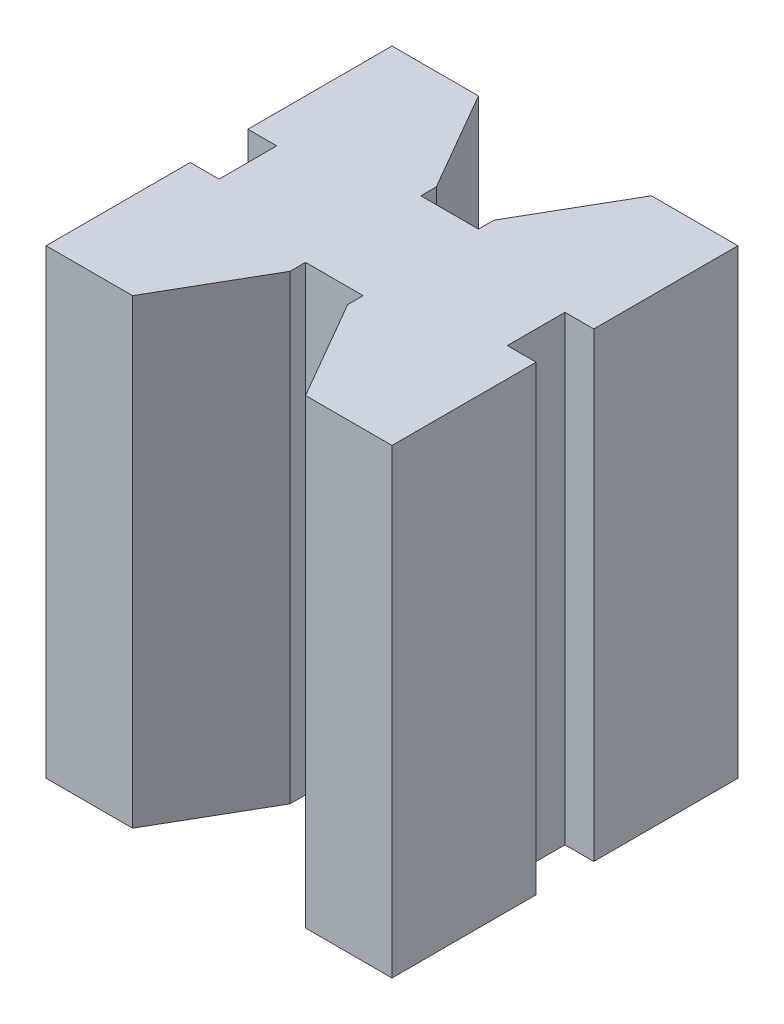
ISO-10303-21;
HEADER;
FILE_DESCRIPTION(('STEP AP214'),'2;1');
FILE_NAME('part.step','',(''),(''),'','','');
FILE_SCHEMA(('AUTOMOTIVE_DESIGN { 1 0 10303 214 1 1 1 1 }'));
ENDSEC;
DATA;
#1=APPLICATION_CONTEXT('core data for automotive mechanical design processes');
#2=APPLICATION_PROTOCOL_DEFINITION('international standard','automotive_design',2000,#1);
#3=PRODUCT_CONTEXT('',#1,'mechanical');
#4=PRODUCT('Part','Part','',(#3));
#5=PRODUCT_RELATED_PRODUCT_CATEGORY('part','',(#4));
#6=PRODUCT_DEFINITION_FORMATION('','',#4);
#7=PRODUCT_DEFINITION_CONTEXT('part definition',#1,'design');
#8=PRODUCT_DEFINITION('design','',#6,#7);
#9=PRODUCT_DEFINITION_SHAPE('','',#8);
#10=(LENGTH_UNIT() NAMED_UNIT(*) SI_UNIT(.MILLI.,.METRE.));
#11=(NAMED_UNIT(*) PLANE_ANGLE_UNIT() SI_UNIT($,.RADIAN.));
#12=(NAMED_UNIT(*) SI_UNIT($,.STERADIAN.) SOLID_ANGLE_UNIT());
#13=UNCERTAINTY_MEASURE_WITH_UNIT(LENGTH_MEASURE(1.E-05),#10,'distance_accuracy_value','');
#14=(GEOMETRIC_REPRESENTATION_CONTEXT(3) GLOBAL_UNCERTAINTY_ASSIGNED_CONTEXT((#13)) GLOBAL_UNIT_ASSIGNED_CONTEXT((#10,
#11,#12)) REPRESENTATION_CONTEXT('',''));
#15=CARTESIAN_POINT('',(0.,0.,0.));
#16=DIRECTION('',(0.,0.,1.));
#17=DIRECTION('',(1.,0.,0.));
#18=AXIS2_PLACEMENT_3D('',#15,#16,#17);
#19=CARTESIAN_POINT('',(0.,40.,12.5));
#20=DIRECTION('',(-1.,0.,0.));
#21=DIRECTION('',(0.,0.,1.));
#22=AXIS2_PLACEMENT_3D('',#19,#20,#21);
#23=PLANE('',#22);
#24=DIRECTION('',(0.,0.,-1.));
#25=VECTOR('',#24,1.);
#26=CARTESIAN_POINT('',(0.,0.,12.5));
#27=LINE('',#26,#25);
#28=CARTESIAN_POINT('',(0.,0.,12.5));
#29=VERTEX_POINT('',#28);
#30=CARTESIAN_POINT('',(0.,0.,0.));
#31=VERTEX_POINT('',#30);
#32=EDGE_CURVE('E230',#29,#31,#27,.T.);
#33=ORIENTED_EDGE('',*,*,#32,.T.);
#34=DIRECTION('',(0.,-1.,0.));
#35=VECTOR('',#34,1.);
#36=CARTESIAN_POINT('',(0.,40.,0.));
#37=LINE('',#36,#35);
#38=CARTESIAN_POINT('',(0.,40.,0.));
#39=VERTEX_POINT('',#38);
#40=EDGE_CURVE('E11',#39,#31,#37,.T.);
#41=ORIENTED_EDGE('',*,*,#40,.F.);
#42=DIRECTION('',(0.,0.,-1.));
#43=VECTOR('',#42,1.);
#44=CARTESIAN_POINT('',(0.,40.,12.5));
#45=LINE('',#44,#43);
#46=CARTESIAN_POINT('',(0.,40.,12.5));
#47=VERTEX_POINT('',#46);
#48=EDGE_CURVE('E276',#47,#39,#45,.T.);
#49=ORIENTED_EDGE('',*,*,#48,.F.);
#50=DIRECTION('',(0.,-1.,0.));
#51=VECTOR('',#50,1.);
#52=CARTESIAN_POINT('',(0.,40.,12.5));
#53=LINE('',#52,#51);
#54=EDGE_CURVE('E226',#47,#29,#53,.T.);
#55=ORIENTED_EDGE('',*,*,#54,.T.);
#56=EDGE_LOOP('',(#33,#41,#49,#55));
#57=FACE_BOUND('',#56,.T.);
#58=ADVANCED_FACE('F38',(#57),#23,.F.);
#59=CARTESIAN_POINT('',(-7.5,40.,0.));
#60=DIRECTION('',(0.,0.,1.));
#61=DIRECTION('',(1.,0.,0.));
#62=AXIS2_PLACEMENT_3D('',#59,#60,#61);
#63=PLANE('',#62);
#64=DIRECTION('',(-1.,0.,0.));
#65=VECTOR('',#64,1.);
#66=CARTESIAN_POINT('',(-7.5,0.,0.));
#67=LINE('',#66,#65);
#68=CARTESIAN_POINT('',(-7.5,0.,0.));
#69=VERTEX_POINT('',#68);
#70=EDGE_CURVE('E233',#31,#69,#67,.T.);
#71=ORIENTED_EDGE('',*,*,#70,.T.);
#72=DIRECTION('',(0.,-1.,0.));
#73=VECTOR('',#72,1.);
#74=CARTESIAN_POINT('',(-7.5,40.,0.));
#75=LINE('',#74,#73);
#76=CARTESIAN_POINT('',(-7.5,40.,0.));
#77=VERTEX_POINT('',#76);
#78=EDGE_CURVE('E46',#77,#69,#75,.T.);
#79=ORIENTED_EDGE('',*,*,#78,.F.);
#80=DIRECTION('',(-1.,0.,0.));
#81=VECTOR('',#80,1.);
#82=CARTESIAN_POINT('',(-7.5,40.,0.));
#83=LINE('',#82,#81);
#84=EDGE_CURVE('E145',#39,#77,#83,.T.);
#85=ORIENTED_EDGE('',*,*,#84,.F.);
#86=ORIENTED_EDGE('',*,*,#40,.T.);
#87=EDGE_LOOP('',(#71,#79,#85,#86));
#88=FACE_BOUND('',#87,.T.);
#89=ADVANCED_FACE('F414',(#88),#63,.F.);
#90=CARTESIAN_POINT('',(-12.5,40.,8.6602540378444));
#91=DIRECTION('',(0.866025403784439,0.,0.5));
#92=DIRECTION('',(0.5,0.,-0.866025403784439));
#93=AXIS2_PLACEMENT_3D('',#90,#91,#92);
#94=PLANE('',#93);
#95=DIRECTION('',(-0.5,0.,0.866025403784439));
#96=VECTOR('',#95,1.);
#97=CARTESIAN_POINT('',(-12.5,0.,8.6602540378444));
#98=LINE('',#97,#96);
#99=CARTESIAN_POINT('',(-12.5,0.,8.6602540378444));
#100=VERTEX_POINT('',#99);
#101=EDGE_CURVE('E235',#69,#100,#98,.T.);
#102=ORIENTED_EDGE('',*,*,#101,.T.);
#103=DIRECTION('',(0.,-1.,0.));
#104=VECTOR('',#103,1.);
#105=CARTESIAN_POINT('',(-12.5,40.,8.6602540378444));
#106=LINE('',#105,#104);
#107=CARTESIAN_POINT('',(-12.5,40.,8.6602540378444));
#108=VERTEX_POINT('',#107);
#109=EDGE_CURVE('E331',#108,#100,#106,.T.);
#110=ORIENTED_EDGE('',*,*,#109,.F.);
#111=DIRECTION('',(-0.5,0.,0.866025403784439));
#112=VECTOR('',#111,1.);
#113=CARTESIAN_POINT('',(-12.5,40.,8.6602540378444));
#114=LINE('',#113,#112);
#115=EDGE_CURVE('E339',#77,#108,#114,.T.);
#116=ORIENTED_EDGE('',*,*,#115,.F.);
#117=ORIENTED_EDGE('',*,*,#78,.T.);
#118=EDGE_LOOP('',(#102,#110,#116,#117));
#119=FACE_BOUND('',#118,.T.);
#120=ADVANCED_FACE('F337',(#119),#94,.F.);
#121=CARTESIAN_POINT('',(-12.5,40.,10.));
#122=DIRECTION('',(1.,0.,0.));
#123=DIRECTION('',(0.,0.,-1.));
#124=AXIS2_PLACEMENT_3D('',#121,#122,#123);
#125=PLANE('',#124);
#126=DIRECTION('',(0.,0.,1.));
#127=VECTOR('',#126,1.);
#128=CARTESIAN_POINT('',(-12.5,0.,10.));
#129=LINE('',#128,#127);
#130=CARTESIAN_POINT('',(-12.5,0.,10.));
#131=VERTEX_POINT('',#130);
#132=EDGE_CURVE('E237',#100,#131,#129,.T.);
#133=ORIENTED_EDGE('',*,*,#132,.T.);
#134=DIRECTION('',(0.,-1.,0.));
#135=VECTOR('',#134,1.);
#136=CARTESIAN_POINT('',(-12.5,40.,10.));
#137=LINE('',#136,#135);
#138=CARTESIAN_POINT('',(-12.5,40.,10.));
#139=VERTEX_POINT('',#138);
#140=EDGE_CURVE('E328',#139,#131,#137,.T.);
#141=ORIENTED_EDGE('',*,*,#140,.F.);
#142=DIRECTION('',(0.,0.,1.));
#143=VECTOR('',#142,1.);
#144=CARTESIAN_POINT('',(-12.5,40.,10.));
#145=LINE('',#144,#143);
#146=EDGE_CURVE('E357',#108,#139,#145,.T.);
#147=ORIENTED_EDGE('',*,*,#146,.F.);
#148=ORIENTED_EDGE('',*,*,#109,.T.);
#149=EDGE_LOOP('',(#133,#141,#147,#148));
#150=FACE_BOUND('',#149,.T.);
#151=ADVANCED_FACE('F348',(#150),#125,.F.);
#152=CARTESIAN_POINT('',(-17.5,40.,10.));
#153=DIRECTION('',(0.,0.,1.));
#154=DIRECTION('',(1.,0.,0.));
#155=AXIS2_PLACEMENT_3D('',#152,#153,#154);
#156=PLANE('',#155);
#157=DIRECTION('',(-1.,0.,0.));
#158=VECTOR('',#157,1.);
#159=CARTESIAN_POINT('',(-17.5,0.,10.));
#160=LINE('',#159,#158);
#161=CARTESIAN_POINT('',(-17.5,0.,10.));
#162=VERTEX_POINT('',#161);
#163=EDGE_CURVE('E239',#131,#162,#160,.T.);
#164=ORIENTED_EDGE('',*,*,#163,.T.);
#165=DIRECTION('',(0.,-1.,0.));
#166=VECTOR('',#165,1.);
#167=CARTESIAN_POINT('',(-17.5,40.,10.));
#168=LINE('',#167,#166);
#169=CARTESIAN_POINT('',(-17.5,40.,10.));
#170=VERTEX_POINT('',#169);
#171=EDGE_CURVE('E325',#170,#162,#168,.T.);
#172=ORIENTED_EDGE('',*,*,#171,.F.);
#173=DIRECTION('',(-1.,0.,0.));
#174=VECTOR('',#173,1.);
#175=CARTESIAN_POINT('',(-17.5,40.,10.));
#176=LINE('',#175,#174);
#177=EDGE_CURVE('E354',#139,#170,#176,.T.);
#178=ORIENTED_EDGE('',*,*,#177,.F.);
#179=ORIENTED_EDGE('',*,*,#140,.T.);
#180=EDGE_LOOP('',(#164,#172,#178,#179));
#181=FACE_BOUND('',#180,.T.);
#182=ADVANCED_FACE('F352',(#181),#156,.F.);
#183=CARTESIAN_POINT('',(-17.5,40.,10.));
#184=DIRECTION('',(-1.,0.,0.));
#185=DIRECTION('',(0.,0.,1.));
#186=AXIS2_PLACEMENT_3D('',#183,#184,#185);
#187=PLANE('',#186);
#188=DIRECTION('',(0.,0.,-1.));
#189=VECTOR('',#188,1.);
#190=CARTESIAN_POINT('',(-17.5,0.,10.));
#191=LINE('',#190,#189);
#192=CARTESIAN_POINT('',(-17.5,0.,8.66025403784438));
#193=VERTEX_POINT('',#192);
#194=EDGE_CURVE('E241',#162,#193,#191,.T.);
#195=ORIENTED_EDGE('',*,*,#194,.T.);
#196=DIRECTION('',(0.,-1.,0.));
#197=VECTOR('',#196,1.);
#198=CARTESIAN_POINT('',(-17.5,40.,8.66025403784438));
#199=LINE('',#198,#197);
#200=CARTESIAN_POINT('',(-17.5,40.,8.66025403784438));
#201=VERTEX_POINT('',#200);
#202=EDGE_CURVE('E322',#201,#193,#199,.T.);
#203=ORIENTED_EDGE('',*,*,#202,.F.);
#204=DIRECTION('',(0.,0.,-1.));
#205=VECTOR('',#204,1.);
#206=CARTESIAN_POINT('',(-17.5,40.,10.));
#207=LINE('',#206,#205);
#208=EDGE_CURVE('E356',#170,#201,#207,.T.);
#209=ORIENTED_EDGE('',*,*,#208,.F.);
#210=ORIENTED_EDGE('',*,*,#171,.T.);
#211=EDGE_LOOP('',(#195,#203,#209,#210));
#212=FACE_BOUND('',#211,.T.);
#213=ADVANCED_FACE('F427',(#212),#187,.F.);
#214=CARTESIAN_POINT('',(-22.5,40.,0.));
#215=DIRECTION('',(-0.866025403784438,0.,0.5));
#216=DIRECTION('',(0.5,0.,0.866025403784439));
#217=AXIS2_PLACEMENT_3D('',#214,#215,#216);
#218=PLANE('',#217);
#219=DIRECTION('',(-0.5,0.,-0.866025403784438));
#220=VECTOR('',#219,1.);
#221=CARTESIAN_POINT('',(-22.5,0.,0.));
#222=LINE('',#221,#220);
#223=CARTESIAN_POINT('',(-22.5,0.,0.));
#224=VERTEX_POINT('',#223);
#225=EDGE_CURVE('E243',#193,#224,#222,.T.);
#226=ORIENTED_EDGE('',*,*,#225,.T.);
#227=DIRECTION('',(0.,-1.,0.));
#228=VECTOR('',#227,1.);
#229=CARTESIAN_POINT('',(-22.5,40.,0.));
#230=LINE('',#229,#228);
#231=CARTESIAN_POINT('',(-22.5,40.,0.));
#232=VERTEX_POINT('',#231);
#233=EDGE_CURVE('E319',#232,#224,#230,.T.);
#234=ORIENTED_EDGE('',*,*,#233,.F.);
#235=DIRECTION('',(-0.5,0.,-0.866025403784438));
#236=VECTOR('',#235,1.);
#237=CARTESIAN_POINT('',(-22.5,40.,0.));
#238=LINE('',#237,#236);
#239=EDGE_CURVE('E359',#201,#232,#238,.T.);
#240=ORIENTED_EDGE('',*,*,#239,.F.);
#241=ORIENTED_EDGE('',*,*,#202,.T.);
#242=EDGE_LOOP('',(#226,#234,#240,#241));
#243=FACE_BOUND('',#242,.T.);
#244=ADVANCED_FACE('F430',(#243),#218,.F.);
#245=CARTESIAN_POINT('',(-30.,40.,0.));
#246=DIRECTION('',(0.,0.,1.));
#247=DIRECTION('',(1.,0.,0.));
#248=AXIS2_PLACEMENT_3D('',#245,#246,#247);
#249=PLANE('',#248);
#250=DIRECTION('',(-1.,0.,0.));
#251=VECTOR('',#250,1.);
#252=CARTESIAN_POINT('',(-30.,0.,0.));
#253=LINE('',#252,#251);
#254=CARTESIAN_POINT('',(-30.,0.,0.));
#255=VERTEX_POINT('',#254);
#256=EDGE_CURVE('E245',#224,#255,#253,.T.);
#257=ORIENTED_EDGE('',*,*,#256,.T.);
#258=DIRECTION('',(0.,-1.,0.));
#259=VECTOR('',#258,1.);
#260=CARTESIAN_POINT('',(-30.,40.,0.));
#261=LINE('',#260,#259);
#262=CARTESIAN_POINT('',(-30.,40.,0.));
#263=VERTEX_POINT('',#262);
#264=EDGE_CURVE('E316',#263,#255,#261,.T.);
#265=ORIENTED_EDGE('',*,*,#264,.F.);
#266=DIRECTION('',(-1.,0.,0.));
#267=VECTOR('',#266,1.);
#268=CARTESIAN_POINT('',(-30.,40.,0.));
#269=LINE('',#268,#267);
#270=EDGE_CURVE('E365',#232,#263,#269,.T.);
#271=ORIENTED_EDGE('',*,*,#270,.F.);
#272=ORIENTED_EDGE('',*,*,#233,.T.);
#273=EDGE_LOOP('',(#257,#265,#271,#272));
#274=FACE_BOUND('',#273,.T.);
#275=ADVANCED_FACE('F434',(#274),#249,.F.);
#276=CARTESIAN_POINT('',(-30.,40.,0.));
#277=DIRECTION('',(1.,0.,0.));
#278=DIRECTION('',(0.,0.,-1.));
#279=AXIS2_PLACEMENT_3D('',#276,#277,#278);
#280=PLANE('',#279);
#281=DIRECTION('',(0.,0.,1.));
#282=VECTOR('',#281,1.);
#283=CARTESIAN_POINT('',(-30.,0.,0.));
#284=LINE('',#283,#282);
#285=CARTESIAN_POINT('',(-30.,0.,12.5));
#286=VERTEX_POINT('',#285);
#287=EDGE_CURVE('E247',#255,#286,#284,.T.);
#288=ORIENTED_EDGE('',*,*,#287,.T.);
#289=DIRECTION('',(0.,-1.,0.));
#290=VECTOR('',#289,1.);
#291=CARTESIAN_POINT('',(-30.,40.,12.5));
#292=LINE('',#291,#290);
#293=CARTESIAN_POINT('',(-30.,40.,12.5));
#294=VERTEX_POINT('',#293);
#295=EDGE_CURVE('E313',#294,#286,#292,.T.);
#296=ORIENTED_EDGE('',*,*,#295,.F.);
#297=DIRECTION('',(0.,0.,1.));
#298=VECTOR('',#297,1.);
#299=CARTESIAN_POINT('',(-30.,40.,0.));
#300=LINE('',#299,#298);
#301=EDGE_CURVE('E367',#263,#294,#300,.T.);
#302=ORIENTED_EDGE('',*,*,#301,.F.);
#303=ORIENTED_EDGE('',*,*,#264,.T.);
#304=EDGE_LOOP('',(#288,#296,#302,#303));
#305=FACE_BOUND('',#304,.T.);
#306=ADVANCED_FACE('F438',(#305),#280,.F.);
#307=CARTESIAN_POINT('',(-30.,40.,12.5));
#308=DIRECTION('',(0.,0.,-1.));
#309=DIRECTION('',(-1.,0.,0.));
#310=AXIS2_PLACEMENT_3D('',#307,#308,#309);
#311=PLANE('',#310);
#312=DIRECTION('',(1.,0.,0.));
#313=VECTOR('',#312,1.);
#314=CARTESIAN_POINT('',(-30.,0.,12.5));
#315=LINE('',#314,#313);
#316=CARTESIAN_POINT('',(-27.5,0.,12.5));
#317=VERTEX_POINT('',#316);
#318=EDGE_CURVE('E249',#286,#317,#315,.T.);
#319=ORIENTED_EDGE('',*,*,#318,.T.);
#320=DIRECTION('',(0.,-1.,0.));
#321=VECTOR('',#320,1.);
#322=CARTESIAN_POINT('',(-27.5,40.,12.5));
#323=LINE('',#322,#321);
#324=CARTESIAN_POINT('',(-27.5,40.,12.5));
#325=VERTEX_POINT('',#324);
#326=EDGE_CURVE('E310',#325,#317,#323,.T.);
#327=ORIENTED_EDGE('',*,*,#326,.F.);
#328=DIRECTION('',(1.,0.,0.));
#329=VECTOR('',#328,1.);
#330=CARTESIAN_POINT('',(-30.,40.,12.5));
#331=LINE('',#330,#329);
#332=EDGE_CURVE('E369',#294,#325,#331,.T.);
#333=ORIENTED_EDGE('',*,*,#332,.F.);
#334=ORIENTED_EDGE('',*,*,#295,.T.);
#335=EDGE_LOOP('',(#319,#327,#333,#334));
#336=FACE_BOUND('',#335,.T.);
#337=ADVANCED_FACE('F442',(#336),#311,.F.);
#338=CARTESIAN_POINT('',(-27.5,40.,12.5));
#339=DIRECTION('',(1.,0.,0.));
#340=DIRECTION('',(0.,0.,-1.));
#341=AXIS2_PLACEMENT_3D('',#338,#339,#340);
#342=PLANE('',#341);
#343=DIRECTION('',(0.,0.,1.));
#344=VECTOR('',#343,1.);
#345=CARTESIAN_POINT('',(-27.5,0.,12.5));
#346=LINE('',#345,#344);
#347=CARTESIAN_POINT('',(-27.5,0.,17.5));
#348=VERTEX_POINT('',#347);
#349=EDGE_CURVE('E251',#317,#348,#346,.T.);
#350=ORIENTED_EDGE('',*,*,#349,.T.);
#351=DIRECTION('',(0.,-1.,0.));
#352=VECTOR('',#351,1.);
#353=CARTESIAN_POINT('',(-27.5,40.,17.5));
#354=LINE('',#353,#352);
#355=CARTESIAN_POINT('',(-27.5,40.,17.5));
#356=VERTEX_POINT('',#355);
#357=EDGE_CURVE('E307',#356,#348,#354,.T.);
#358=ORIENTED_EDGE('',*,*,#357,.F.);
#359=DIRECTION('',(0.,0.,1.));
#360=VECTOR('',#359,1.);
#361=CARTESIAN_POINT('',(-27.5,40.,12.5));
#362=LINE('',#361,#360);
#363=EDGE_CURVE('E371',#325,#356,#362,.T.);
#364=ORIENTED_EDGE('',*,*,#363,.F.);
#365=ORIENTED_EDGE('',*,*,#326,.T.);
#366=EDGE_LOOP('',(#350,#358,#364,#365));
#367=FACE_BOUND('',#366,.T.);
#368=ADVANCED_FACE('F446',(#367),#342,.F.);
#369=CARTESIAN_POINT('',(-27.5,40.,17.5));
#370=DIRECTION('',(0.,0.,1.));
#371=DIRECTION('',(1.,0.,0.));
#372=AXIS2_PLACEMENT_3D('',#369,#370,#371);
#373=PLANE('',#372);
#374=DIRECTION('',(-1.,0.,0.));
#375=VECTOR('',#374,1.);
#376=CARTESIAN_POINT('',(-27.5,0.,17.5));
#377=LINE('',#376,#375);
#378=CARTESIAN_POINT('',(-30.,0.,17.5));
#379=VERTEX_POINT('',#378);
#380=EDGE_CURVE('E253',#348,#379,#377,.T.);
#381=ORIENTED_EDGE('',*,*,#380,.T.);
#382=DIRECTION('',(0.,-1.,0.));
#383=VECTOR('',#382,1.);
#384=CARTESIAN_POINT('',(-30.,40.,17.5));
#385=LINE('',#384,#383);
#386=CARTESIAN_POINT('',(-30.,40.,17.5));
#387=VERTEX_POINT('',#386);
#388=EDGE_CURVE('E304',#387,#379,#385,.T.);
#389=ORIENTED_EDGE('',*,*,#388,.F.);
#390=DIRECTION('',(-1.,0.,0.));
#391=VECTOR('',#390,1.);
#392=CARTESIAN_POINT('',(-27.5,40.,17.5));
#393=LINE('',#392,#391);
#394=EDGE_CURVE('E373',#356,#387,#393,.T.);
#395=ORIENTED_EDGE('',*,*,#394,.F.);
#396=ORIENTED_EDGE('',*,*,#357,.T.);
#397=EDGE_LOOP('',(#381,#389,#395,#396));
#398=FACE_BOUND('',#397,.T.);
#399=ADVANCED_FACE('F450',(#398),#373,.F.);
#400=CARTESIAN_POINT('',(-30.,40.,17.5));
#401=DIRECTION('',(1.,0.,0.));
#402=DIRECTION('',(0.,0.,-1.));
#403=AXIS2_PLACEMENT_3D('',#400,#401,#402);
#404=PLANE('',#403);
#405=DIRECTION('',(0.,0.,1.));
#406=VECTOR('',#405,1.);
#407=CARTESIAN_POINT('',(-30.,0.,17.5));
#408=LINE('',#407,#406);
#409=CARTESIAN_POINT('',(-30.,0.,30.));
#410=VERTEX_POINT('',#409);
#411=EDGE_CURVE('E255',#379,#410,#408,.T.);
#412=ORIENTED_EDGE('',*,*,#411,.T.);
#413=DIRECTION('',(0.,-1.,0.));
#414=VECTOR('',#413,1.);
#415=CARTESIAN_POINT('',(-30.,40.,30.));
#416=LINE('',#415,#414);
#417=CARTESIAN_POINT('',(-30.,40.,30.));
#418=VERTEX_POINT('',#417);
#419=EDGE_CURVE('E301',#418,#410,#416,.T.);
#420=ORIENTED_EDGE('',*,*,#419,.F.);
#421=DIRECTION('',(0.,0.,1.));
#422=VECTOR('',#421,1.);
#423=CARTESIAN_POINT('',(-30.,40.,17.5));
#424=LINE('',#423,#422);
#425=EDGE_CURVE('E375',#387,#418,#424,.T.);
#426=ORIENTED_EDGE('',*,*,#425,.F.);
#427=ORIENTED_EDGE('',*,*,#388,.T.);
#428=EDGE_LOOP('',(#412,#420,#426,#427));
#429=FACE_BOUND('',#428,.T.);
#430=ADVANCED_FACE('F454',(#429),#404,.F.);
#431=CARTESIAN_POINT('',(-30.,40.,30.));
#432=DIRECTION('',(0.,0.,-1.));
#433=DIRECTION('',(-1.,0.,0.));
#434=AXIS2_PLACEMENT_3D('',#431,#432,#433);
#435=PLANE('',#434);
#436=DIRECTION('',(1.,0.,0.));
#437=VECTOR('',#436,1.);
#438=CARTESIAN_POINT('',(-30.,0.,30.));
#439=LINE('',#438,#437);
#440=CARTESIAN_POINT('',(-22.5,0.,30.));
#441=VERTEX_POINT('',#440);
#442=EDGE_CURVE('E257',#410,#441,#439,.T.);
#443=ORIENTED_EDGE('',*,*,#442,.T.);
#444=DIRECTION('',(0.,-1.,0.));
#445=VECTOR('',#444,1.);
#446=CARTESIAN_POINT('',(-22.5,40.,30.));
#447=LINE('',#446,#445);
#448=CARTESIAN_POINT('',(-22.5,40.,30.));
#449=VERTEX_POINT('',#448);
#450=EDGE_CURVE('E298',#449,#441,#447,.T.);
#451=ORIENTED_EDGE('',*,*,#450,.F.);
#452=DIRECTION('',(1.,0.,0.));
#453=VECTOR('',#452,1.);
#454=CARTESIAN_POINT('',(-30.,40.,30.));
#455=LINE('',#454,#453);
#456=EDGE_CURVE('E377',#418,#449,#455,.T.);
#457=ORIENTED_EDGE('',*,*,#456,.F.);
#458=ORIENTED_EDGE('',*,*,#419,.T.);
#459=EDGE_LOOP('',(#443,#451,#457,#458));
#460=FACE_BOUND('',#459,.T.);
#461=ADVANCED_FACE('F458',(#460),#435,.F.);
#462=CARTESIAN_POINT('',(-17.5,40.,21.3397459621556));
#463=DIRECTION('',(-0.866025403784439,0.,-0.5));
#464=DIRECTION('',(-0.5,0.,0.866025403784439));
#465=AXIS2_PLACEMENT_3D('',#462,#463,#464);
#466=PLANE('',#465);
#467=DIRECTION('',(0.5,0.,-0.866025403784438));
#468=VECTOR('',#467,1.);
#469=CARTESIAN_POINT('',(-17.5,0.,21.3397459621556));
#470=LINE('',#469,#468);
#471=CARTESIAN_POINT('',(-17.5,0.,21.3397459621556));
#472=VERTEX_POINT('',#471);
#473=EDGE_CURVE('E259',#441,#472,#470,.T.);
#474=ORIENTED_EDGE('',*,*,#473,.T.);
#475=DIRECTION('',(0.,-1.,0.));
#476=VECTOR('',#475,1.);
#477=CARTESIAN_POINT('',(-17.5,40.,21.3397459621556));
#478=LINE('',#477,#476);
#479=CARTESIAN_POINT('',(-17.5,40.,21.3397459621556));
#480=VERTEX_POINT('',#479);
#481=EDGE_CURVE('E295',#480,#472,#478,.T.);
#482=ORIENTED_EDGE('',*,*,#481,.F.);
#483=DIRECTION('',(0.5,0.,-0.866025403784438));
#484=VECTOR('',#483,1.);
#485=CARTESIAN_POINT('',(-17.5,40.,21.3397459621556));
#486=LINE('',#485,#484);
#487=EDGE_CURVE('E379',#449,#480,#486,.T.);
#488=ORIENTED_EDGE('',*,*,#487,.F.);
#489=ORIENTED_EDGE('',*,*,#450,.T.);
#490=EDGE_LOOP('',(#474,#482,#488,#489));
#491=FACE_BOUND('',#490,.T.);
#492=ADVANCED_FACE('F462',(#491),#466,.F.);
#493=CARTESIAN_POINT('',(-17.5,40.,20.));
#494=DIRECTION('',(-1.,0.,0.));
#495=DIRECTION('',(0.,0.,1.));
#496=AXIS2_PLACEMENT_3D('',#493,#494,#495);
#497=PLANE('',#496);
#498=DIRECTION('',(0.,0.,-1.));
#499=VECTOR('',#498,1.);
#500=CARTESIAN_POINT('',(-17.5,0.,20.));
#501=LINE('',#500,#499);
#502=CARTESIAN_POINT('',(-17.5,0.,20.));
#503=VERTEX_POINT('',#502);
#504=EDGE_CURVE('E261',#472,#503,#501,.T.);
#505=ORIENTED_EDGE('',*,*,#504,.T.);
#506=DIRECTION('',(0.,-1.,0.));
#507=VECTOR('',#506,1.);
#508=CARTESIAN_POINT('',(-17.5,40.,20.));
#509=LINE('',#508,#507);
#510=CARTESIAN_POINT('',(-17.5,40.,20.));
#511=VERTEX_POINT('',#510);
#512=EDGE_CURVE('E292',#511,#503,#509,.T.);
#513=ORIENTED_EDGE('',*,*,#512,.F.);
#514=DIRECTION('',(0.,0.,-1.));
#515=VECTOR('',#514,1.);
#516=CARTESIAN_POINT('',(-17.5,40.,20.));
#517=LINE('',#516,#515);
#518=EDGE_CURVE('E381',#480,#511,#517,.T.);
#519=ORIENTED_EDGE('',*,*,#518,.F.);
#520=ORIENTED_EDGE('',*,*,#481,.T.);
#521=EDGE_LOOP('',(#505,#513,#519,#520));
#522=FACE_BOUND('',#521,.T.);
#523=ADVANCED_FACE('F466',(#522),#497,.F.);
#524=CARTESIAN_POINT('',(-17.5,40.,20.));
#525=DIRECTION('',(0.,0.,-1.));
#526=DIRECTION('',(-1.,0.,0.));
#527=AXIS2_PLACEMENT_3D('',#524,#525,#526);
#528=PLANE('',#527);
#529=DIRECTION('',(1.,0.,0.));
#530=VECTOR('',#529,1.);
#531=CARTESIAN_POINT('',(-17.5,0.,20.));
#532=LINE('',#531,#530);
#533=CARTESIAN_POINT('',(-12.5,0.,20.));
#534=VERTEX_POINT('',#533);
#535=EDGE_CURVE('E263',#503,#534,#532,.T.);
#536=ORIENTED_EDGE('',*,*,#535,.T.);
#537=DIRECTION('',(0.,-1.,0.));
#538=VECTOR('',#537,1.);
#539=CARTESIAN_POINT('',(-12.5,40.,20.));
#540=LINE('',#539,#538);
#541=CARTESIAN_POINT('',(-12.5,40.,20.));
#542=VERTEX_POINT('',#541);
#543=EDGE_CURVE('E289',#542,#534,#540,.T.);
#544=ORIENTED_EDGE('',*,*,#543,.F.);
#545=DIRECTION('',(1.,0.,0.));
#546=VECTOR('',#545,1.);
#547=CARTESIAN_POINT('',(-17.5,40.,20.));
#548=LINE('',#547,#546);
#549=EDGE_CURVE('E383',#511,#542,#548,.T.);
#550=ORIENTED_EDGE('',*,*,#549,.F.);
#551=ORIENTED_EDGE('',*,*,#512,.T.);
#552=EDGE_LOOP('',(#536,#544,#550,#551));
#553=FACE_BOUND('',#552,.T.);
#554=ADVANCED_FACE('F470',(#553),#528,.F.);
#555=CARTESIAN_POINT('',(-12.5,40.,20.));
#556=DIRECTION('',(1.,0.,0.));
#557=DIRECTION('',(0.,0.,-1.));
#558=AXIS2_PLACEMENT_3D('',#555,#556,#557);
#559=PLANE('',#558);
#560=DIRECTION('',(0.,0.,1.));
#561=VECTOR('',#560,1.);
#562=CARTESIAN_POINT('',(-12.5,0.,20.));
#563=LINE('',#562,#561);
#564=CARTESIAN_POINT('',(-12.5,0.,21.3397459621556));
#565=VERTEX_POINT('',#564);
#566=EDGE_CURVE('E265',#534,#565,#563,.T.);
#567=ORIENTED_EDGE('',*,*,#566,.T.);
#568=DIRECTION('',(0.,-1.,0.));
#569=VECTOR('',#568,1.);
#570=CARTESIAN_POINT('',(-12.5,40.,21.3397459621556));
#571=LINE('',#570,#569);
#572=CARTESIAN_POINT('',(-12.5,40.,21.3397459621556));
#573=VERTEX_POINT('',#572);
#574=EDGE_CURVE('E286',#573,#565,#571,.T.);
#575=ORIENTED_EDGE('',*,*,#574,.F.);
#576=DIRECTION('',(0.,0.,1.));
#577=VECTOR('',#576,1.);
#578=CARTESIAN_POINT('',(-12.5,40.,20.));
#579=LINE('',#578,#577);
#580=EDGE_CURVE('E385',#542,#573,#579,.T.);
#581=ORIENTED_EDGE('',*,*,#580,.F.);
#582=ORIENTED_EDGE('',*,*,#543,.T.);
#583=EDGE_LOOP('',(#567,#575,#581,#582));
#584=FACE_BOUND('',#583,.T.);
#585=ADVANCED_FACE('F474',(#584),#559,.F.);
#586=CARTESIAN_POINT('',(-7.5,40.,30.));
#587=DIRECTION('',(0.866025403784438,0.,-0.5));
#588=DIRECTION('',(-0.5,0.,-0.866025403784439));
#589=AXIS2_PLACEMENT_3D('',#586,#587,#588);
#590=PLANE('',#589);
#591=DIRECTION('',(0.5,0.,0.866025403784438));
#592=VECTOR('',#591,1.);
#593=CARTESIAN_POINT('',(-7.5,0.,30.));
#594=LINE('',#593,#592);
#595=CARTESIAN_POINT('',(-7.5,0.,30.));
#596=VERTEX_POINT('',#595);
#597=EDGE_CURVE('E267',#565,#596,#594,.T.);
#598=ORIENTED_EDGE('',*,*,#597,.T.);
#599=DIRECTION('',(0.,-1.,0.));
#600=VECTOR('',#599,1.);
#601=CARTESIAN_POINT('',(-7.5,40.,30.));
#602=LINE('',#601,#600);
#603=CARTESIAN_POINT('',(-7.5,40.,30.));
#604=VERTEX_POINT('',#603);
#605=EDGE_CURVE('E283',#604,#596,#602,.T.);
#606=ORIENTED_EDGE('',*,*,#605,.F.);
#607=DIRECTION('',(0.5,0.,0.866025403784438));
#608=VECTOR('',#607,1.);
#609=CARTESIAN_POINT('',(-7.5,40.,30.));
#610=LINE('',#609,#608);
#611=EDGE_CURVE('E387',#573,#604,#610,.T.);
#612=ORIENTED_EDGE('',*,*,#611,.F.);
#613=ORIENTED_EDGE('',*,*,#574,.T.);
#614=EDGE_LOOP('',(#598,#606,#612,#613));
#615=FACE_BOUND('',#614,.T.);
#616=ADVANCED_FACE('F478',(#615),#590,.F.);
#617=CARTESIAN_POINT('',(-7.5,40.,30.));
#618=DIRECTION('',(0.,0.,-1.));
#619=DIRECTION('',(-1.,0.,0.));
#620=AXIS2_PLACEMENT_3D('',#617,#618,#619);
#621=PLANE('',#620);
#622=DIRECTION('',(1.,0.,0.));
#623=VECTOR('',#622,1.);
#624=CARTESIAN_POINT('',(-7.5,0.,30.));
#625=LINE('',#624,#623);
#626=CARTESIAN_POINT('',(0.,0.,30.));
#627=VERTEX_POINT('',#626);
#628=EDGE_CURVE('E269',#596,#627,#625,.T.);
#629=ORIENTED_EDGE('',*,*,#628,.T.);
#630=DIRECTION('',(0.,-1.,0.));
#631=VECTOR('',#630,1.);
#632=CARTESIAN_POINT('',(0.,40.,30.));
#633=LINE('',#632,#631);
#634=CARTESIAN_POINT('',(0.,40.,30.));
#635=VERTEX_POINT('',#634);
#636=EDGE_CURVE('E280',#635,#627,#633,.T.);
#637=ORIENTED_EDGE('',*,*,#636,.F.);
#638=DIRECTION('',(1.,0.,0.));
#639=VECTOR('',#638,1.);
#640=CARTESIAN_POINT('',(-7.5,40.,30.));
#641=LINE('',#640,#639);
#642=EDGE_CURVE('E389',#604,#635,#641,.T.);
#643=ORIENTED_EDGE('',*,*,#642,.F.);
#644=ORIENTED_EDGE('',*,*,#605,.T.);
#645=EDGE_LOOP('',(#629,#637,#643,#644));
#646=FACE_BOUND('',#645,.T.);
#647=ADVANCED_FACE('F395',(#646),#621,.F.);
#648=CARTESIAN_POINT('',(0.,40.,17.5));
#649=DIRECTION('',(-1.,0.,0.));
#650=DIRECTION('',(0.,0.,1.));
#651=AXIS2_PLACEMENT_3D('',#648,#649,#650);
#652=PLANE('',#651);
#653=DIRECTION('',(0.,0.,-1.));
#654=VECTOR('',#653,1.);
#655=CARTESIAN_POINT('',(0.,0.,17.5));
#656=LINE('',#655,#654);
#657=CARTESIAN_POINT('',(0.,0.,17.5));
#658=VERTEX_POINT('',#657);
#659=EDGE_CURVE('E271',#627,#658,#656,.T.);
#660=ORIENTED_EDGE('',*,*,#659,.T.);
#661=DIRECTION('',(0.,-1.,0.));
#662=VECTOR('',#661,1.);
#663=CARTESIAN_POINT('',(0.,40.,17.5));
#664=LINE('',#663,#662);
#665=CARTESIAN_POINT('',(0.,40.,17.5));
#666=VERTEX_POINT('',#665);
#667=EDGE_CURVE('E221',#666,#658,#664,.T.);
#668=ORIENTED_EDGE('',*,*,#667,.F.);
#669=DIRECTION('',(0.,0.,-1.));
#670=VECTOR('',#669,1.);
#671=CARTESIAN_POINT('',(0.,40.,17.5));
#672=LINE('',#671,#670);
#673=EDGE_CURVE('E212',#635,#666,#672,.T.);
#674=ORIENTED_EDGE('',*,*,#673,.F.);
#675=ORIENTED_EDGE('',*,*,#636,.T.);
#676=EDGE_LOOP('',(#660,#668,#674,#675));
#677=FACE_BOUND('',#676,.T.);
#678=ADVANCED_FACE('F399',(#677),#652,.F.);
#679=CARTESIAN_POINT('',(-2.5,40.,17.5));
#680=DIRECTION('',(0.,0.,1.));
#681=DIRECTION('',(1.,0.,0.));
#682=AXIS2_PLACEMENT_3D('',#679,#680,#681);
#683=PLANE('',#682);
#684=DIRECTION('',(-1.,0.,0.));
#685=VECTOR('',#684,1.);
#686=CARTESIAN_POINT('',(-2.5,0.,17.5));
#687=LINE('',#686,#685);
#688=CARTESIAN_POINT('',(-2.5,0.,17.5));
#689=VERTEX_POINT('',#688);
#690=EDGE_CURVE('E220',#658,#689,#687,.T.);
#691=ORIENTED_EDGE('',*,*,#690,.T.);
#692=DIRECTION('',(0.,-1.,0.));
#693=VECTOR('',#692,1.);
#694=CARTESIAN_POINT('',(-2.5,40.,17.5));
#695=LINE('',#694,#693);
#696=CARTESIAN_POINT('',(-2.5,40.,17.5));
#697=VERTEX_POINT('',#696);
#698=EDGE_CURVE('E217',#697,#689,#695,.T.);
#699=ORIENTED_EDGE('',*,*,#698,.F.);
#700=DIRECTION('',(-1.,0.,0.));
#701=VECTOR('',#700,1.);
#702=CARTESIAN_POINT('',(-2.5,40.,17.5));
#703=LINE('',#702,#701);
#704=EDGE_CURVE('E206',#666,#697,#703,.T.);
#705=ORIENTED_EDGE('',*,*,#704,.F.);
#706=ORIENTED_EDGE('',*,*,#667,.T.);
#707=EDGE_LOOP('',(#691,#699,#705,#706));
#708=FACE_BOUND('',#707,.T.);
#709=ADVANCED_FACE('F218',(#708),#683,.F.);
#710=CARTESIAN_POINT('',(-2.5,40.,12.5));
#711=DIRECTION('',(-1.,0.,0.));
#712=DIRECTION('',(0.,0.,1.));
#713=AXIS2_PLACEMENT_3D('',#710,#711,#712);
#714=PLANE('',#713);
#715=DIRECTION('',(0.,0.,-1.));
#716=VECTOR('',#715,1.);
#717=CARTESIAN_POINT('',(-2.5,0.,12.5));
#718=LINE('',#717,#716);
#719=CARTESIAN_POINT('',(-2.5,0.,12.5));
#720=VERTEX_POINT('',#719);
#721=EDGE_CURVE('E131',#689,#720,#718,.T.);
#722=ORIENTED_EDGE('',*,*,#721,.T.);
#723=DIRECTION('',(0.,-1.,0.));
#724=VECTOR('',#723,1.);
#725=CARTESIAN_POINT('',(-2.5,40.,12.5));
#726=LINE('',#725,#724);
#727=CARTESIAN_POINT('',(-2.5,40.,12.5));
#728=VERTEX_POINT('',#727);
#729=EDGE_CURVE('E222',#728,#720,#726,.T.);
#730=ORIENTED_EDGE('',*,*,#729,.F.);
#731=DIRECTION('',(0.,0.,-1.));
#732=VECTOR('',#731,1.);
#733=CARTESIAN_POINT('',(-2.5,40.,12.5));
#734=LINE('',#733,#732);
#735=EDGE_CURVE('E210',#697,#728,#734,.T.);
#736=ORIENTED_EDGE('',*,*,#735,.F.);
#737=ORIENTED_EDGE('',*,*,#698,.T.);
#738=EDGE_LOOP('',(#722,#730,#736,#737));
#739=FACE_BOUND('',#738,.T.);
#740=ADVANCED_FACE('F224',(#739),#714,.F.);
#741=CARTESIAN_POINT('',(0.,40.,12.5));
#742=DIRECTION('',(0.,0.,-1.));
#743=DIRECTION('',(-1.,0.,0.));
#744=AXIS2_PLACEMENT_3D('',#741,#742,#743);
#745=PLANE('',#744);
#746=DIRECTION('',(1.,0.,0.));
#747=VECTOR('',#746,1.);
#748=CARTESIAN_POINT('',(0.,0.,12.5));
#749=LINE('',#748,#747);
#750=EDGE_CURVE('E137',#720,#29,#749,.T.);
#751=ORIENTED_EDGE('',*,*,#750,.T.);
#752=ORIENTED_EDGE('',*,*,#54,.F.);
#753=DIRECTION('',(1.,0.,0.));
#754=VECTOR('',#753,1.);
#755=CARTESIAN_POINT('',(0.,40.,12.5));
#756=LINE('',#755,#754);
#757=EDGE_CURVE('E54',#728,#47,#756,.T.);
#758=ORIENTED_EDGE('',*,*,#757,.F.);
#759=ORIENTED_EDGE('',*,*,#729,.T.);
#760=EDGE_LOOP('',(#751,#752,#758,#759));
#761=FACE_BOUND('',#760,.T.);
#762=ADVANCED_FACE('F403',(#761),#745,.F.);
#763=CARTESIAN_POINT('',(0.,40.,0.));
#764=DIRECTION('',(0.,-1.,0.));
#765=DIRECTION('',(0.,0.,-1.));
#766=AXIS2_PLACEMENT_3D('',#763,#764,#765);
#767=PLANE('',#766);
#768=ORIENTED_EDGE('',*,*,#48,.T.);
#769=ORIENTED_EDGE('',*,*,#84,.T.);
#770=ORIENTED_EDGE('',*,*,#115,.T.);
#771=ORIENTED_EDGE('',*,*,#146,.T.);
#772=ORIENTED_EDGE('',*,*,#177,.T.);
#773=ORIENTED_EDGE('',*,*,#208,.T.);
#774=ORIENTED_EDGE('',*,*,#239,.T.);
#775=ORIENTED_EDGE('',*,*,#270,.T.);
#776=ORIENTED_EDGE('',*,*,#301,.T.);
#777=ORIENTED_EDGE('',*,*,#332,.T.);
#778=ORIENTED_EDGE('',*,*,#363,.T.);
#779=ORIENTED_EDGE('',*,*,#394,.T.);
#780=ORIENTED_EDGE('',*,*,#425,.T.);
#781=ORIENTED_EDGE('',*,*,#456,.T.);
#782=ORIENTED_EDGE('',*,*,#487,.T.);
#783=ORIENTED_EDGE('',*,*,#518,.T.);
#784=ORIENTED_EDGE('',*,*,#549,.T.);
#785=ORIENTED_EDGE('',*,*,#580,.T.);
#786=ORIENTED_EDGE('',*,*,#611,.T.);
#787=ORIENTED_EDGE('',*,*,#642,.T.);
#788=ORIENTED_EDGE('',*,*,#673,.T.);
#789=ORIENTED_EDGE('',*,*,#704,.T.);
#790=ORIENTED_EDGE('',*,*,#735,.T.);
#791=ORIENTED_EDGE('',*,*,#757,.T.);
#792=EDGE_LOOP('',(#768,#769,#770,#771,#772,#773,#774,#775,#776,#777,#778,#779,#780,#781,#782,
#783,#784,#785,#786,#787,#788,#789,#790,#791));
#793=FACE_BOUND('',#792,.T.);
#794=ADVANCED_FACE('F208',(#793),#767,.F.);
#795=CARTESIAN_POINT('',(0.,0.,0.));
#796=DIRECTION('',(0.,-1.,0.));
#797=DIRECTION('',(0.,0.,-1.));
#798=AXIS2_PLACEMENT_3D('',#795,#796,#797);
#799=PLANE('',#798);
#800=ORIENTED_EDGE('',*,*,#32,.F.);
#801=ORIENTED_EDGE('',*,*,#750,.F.);
#802=ORIENTED_EDGE('',*,*,#721,.F.);
#803=ORIENTED_EDGE('',*,*,#690,.F.);
#804=ORIENTED_EDGE('',*,*,#659,.F.);
#805=ORIENTED_EDGE('',*,*,#628,.F.);
#806=ORIENTED_EDGE('',*,*,#597,.F.);
#807=ORIENTED_EDGE('',*,*,#566,.F.);
#808=ORIENTED_EDGE('',*,*,#535,.F.);
#809=ORIENTED_EDGE('',*,*,#504,.F.);
#810=ORIENTED_EDGE('',*,*,#473,.F.);
#811=ORIENTED_EDGE('',*,*,#442,.F.);
#812=ORIENTED_EDGE('',*,*,#411,.F.);
#813=ORIENTED_EDGE('',*,*,#380,.F.);
#814=ORIENTED_EDGE('',*,*,#349,.F.);
#815=ORIENTED_EDGE('',*,*,#318,.F.);
#816=ORIENTED_EDGE('',*,*,#287,.F.);
#817=ORIENTED_EDGE('',*,*,#256,.F.);
#818=ORIENTED_EDGE('',*,*,#225,.F.);
#819=ORIENTED_EDGE('',*,*,#194,.F.);
#820=ORIENTED_EDGE('',*,*,#163,.F.);
#821=ORIENTED_EDGE('',*,*,#132,.F.);
#822=ORIENTED_EDGE('',*,*,#101,.F.);
#823=ORIENTED_EDGE('',*,*,#70,.F.);
#824=EDGE_LOOP('',(#800,#801,#802,#803,#804,#805,#806,#807,#808,#809,#810,#811,#812,#813,#814,
#815,#816,#817,#818,#819,#820,#821,#822,#823));
#825=FACE_BOUND('',#824,.T.);
#826=ADVANCED_FACE('F343',(#825),#799,.T.);
#827=CLOSED_SHELL('',(#58,#89,#120,#151,#182,#213,#244,#275,#306,#337,#368,#399,#430,#461,#492,
#523,#554,#585,#616,#647,#678,#709,#740,#762,#794,#826));
#828=MANIFOLD_SOLID_BREP('B2',#827);
#829=ADVANCED_BREP_SHAPE_REPRESENTATION('',(#18,#828),#14);
#830=SHAPE_DEFINITION_REPRESENTATION(#9,#829);
ENDSEC;
END-ISO-10303-21;
